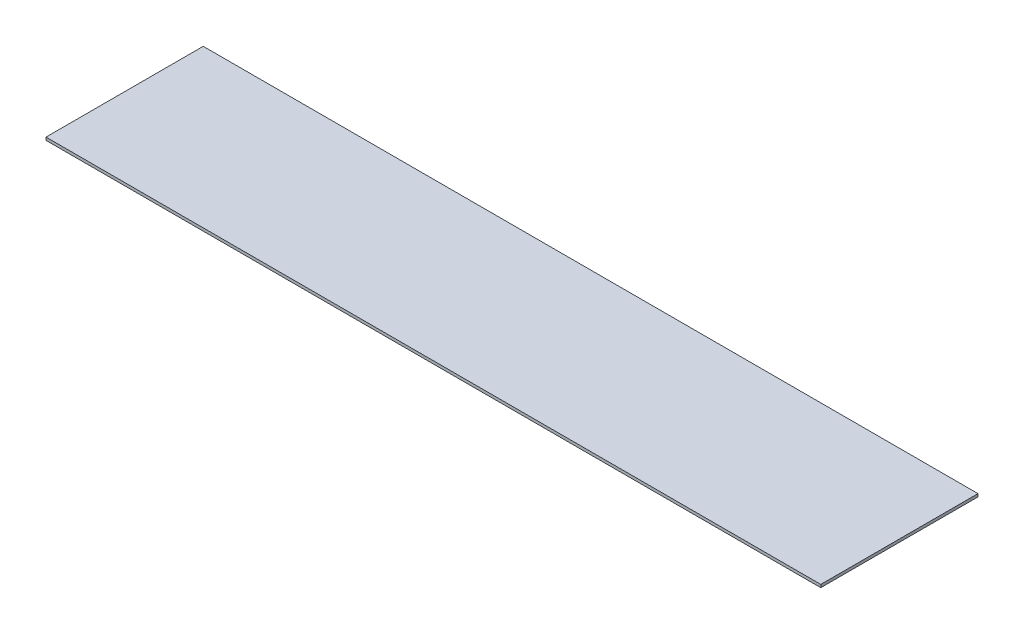
ISO-10303-21;
HEADER;
FILE_DESCRIPTION(('STEP AP214'),'2;1');
FILE_NAME('part.step','',(''),(''),'','','');
FILE_SCHEMA(('AUTOMOTIVE_DESIGN { 1 0 10303 214 1 1 1 1 }'));
ENDSEC;
DATA;
#1=APPLICATION_CONTEXT('core data for automotive mechanical design processes');
#2=APPLICATION_PROTOCOL_DEFINITION('international standard','automotive_design',2000,#1);
#3=PRODUCT_CONTEXT('',#1,'mechanical');
#4=PRODUCT('Part','Part','',(#3));
#5=PRODUCT_RELATED_PRODUCT_CATEGORY('part','',(#4));
#6=PRODUCT_DEFINITION_FORMATION('','',#4);
#7=PRODUCT_DEFINITION_CONTEXT('part definition',#1,'design');
#8=PRODUCT_DEFINITION('design','',#6,#7);
#9=PRODUCT_DEFINITION_SHAPE('','',#8);
#10=(LENGTH_UNIT() NAMED_UNIT(*) SI_UNIT(.MILLI.,.METRE.));
#11=(NAMED_UNIT(*) PLANE_ANGLE_UNIT() SI_UNIT($,.RADIAN.));
#12=(NAMED_UNIT(*) SI_UNIT($,.STERADIAN.) SOLID_ANGLE_UNIT());
#13=UNCERTAINTY_MEASURE_WITH_UNIT(LENGTH_MEASURE(1.E-05),#10,'distance_accuracy_value','');
#14=(GEOMETRIC_REPRESENTATION_CONTEXT(3) GLOBAL_UNCERTAINTY_ASSIGNED_CONTEXT((#13)) GLOBAL_UNIT_ASSIGNED_CONTEXT((#10,
#11,#12)) REPRESENTATION_CONTEXT('',''));
#15=CARTESIAN_POINT('',(0.,0.,0.));
#16=DIRECTION('',(0.,0.,1.));
#17=DIRECTION('',(1.,0.,0.));
#18=AXIS2_PLACEMENT_3D('',#15,#16,#17);
#19=CARTESIAN_POINT('',(0.,0.,110.));
#20=DIRECTION('',(0.,0.,1.));
#21=DIRECTION('',(1.,0.,0.));
#22=AXIS2_PLACEMENT_3D('',#19,#20,#21);
#23=PLANE('',#22);
#24=DIRECTION('',(-1.,0.,0.));
#25=VECTOR('',#24,1.);
#26=CARTESIAN_POINT('',(0.,-1.,110.));
#27=LINE('',#26,#25);
#28=CARTESIAN_POINT('',(271.,-1.,110.));
#29=VERTEX_POINT('',#28);
#30=CARTESIAN_POINT('',(-271.,-1.,110.));
#31=VERTEX_POINT('',#30);
#32=EDGE_CURVE('E10',#29,#31,#27,.T.);
#33=ORIENTED_EDGE('',*,*,#32,.F.);
#34=DIRECTION('',(0.,-1.,0.));
#35=VECTOR('',#34,1.);
#36=CARTESIAN_POINT('',(271.,0.,110.));
#37=LINE('',#36,#35);
#38=CARTESIAN_POINT('',(271.,1.,110.));
#39=VERTEX_POINT('',#38);
#40=EDGE_CURVE('E60',#39,#29,#37,.T.);
#41=ORIENTED_EDGE('',*,*,#40,.F.);
#42=DIRECTION('',(1.,0.,0.));
#43=VECTOR('',#42,1.);
#44=CARTESIAN_POINT('',(0.,1.,110.));
#45=LINE('',#44,#43);
#46=CARTESIAN_POINT('',(-271.,1.,110.));
#47=VERTEX_POINT('',#46);
#48=EDGE_CURVE('E86',#47,#39,#45,.T.);
#49=ORIENTED_EDGE('',*,*,#48,.F.);
#50=DIRECTION('',(0.,1.,0.));
#51=VECTOR('',#50,1.);
#52=CARTESIAN_POINT('',(-271.,0.,110.));
#53=LINE('',#52,#51);
#54=EDGE_CURVE('E23',#31,#47,#53,.T.);
#55=ORIENTED_EDGE('',*,*,#54,.F.);
#56=EDGE_LOOP('',(#33,#41,#49,#55));
#57=FACE_BOUND('',#56,.T.);
#58=ADVANCED_FACE('F16',(#57),#23,.T.);
#59=CARTESIAN_POINT('',(0.,-1.,0.));
#60=DIRECTION('',(0.,-1.,0.));
#61=DIRECTION('',(0.,0.,-1.));
#62=AXIS2_PLACEMENT_3D('',#59,#60,#61);
#63=PLANE('',#62);
#64=DIRECTION('',(0.,0.,1.));
#65=VECTOR('',#64,1.);
#66=CARTESIAN_POINT('',(271.,-1.,0.));
#67=LINE('',#66,#65);
#68=CARTESIAN_POINT('',(271.,-1.,0.));
#69=VERTEX_POINT('',#68);
#70=EDGE_CURVE('E53',#69,#29,#67,.T.);
#71=ORIENTED_EDGE('',*,*,#70,.T.);
#72=ORIENTED_EDGE('',*,*,#32,.T.);
#73=DIRECTION('',(0.,0.,1.));
#74=VECTOR('',#73,1.);
#75=CARTESIAN_POINT('',(-271.,-1.,0.));
#76=LINE('',#75,#74);
#77=CARTESIAN_POINT('',(-271.,-1.,0.));
#78=VERTEX_POINT('',#77);
#79=EDGE_CURVE('E66',#78,#31,#76,.T.);
#80=ORIENTED_EDGE('',*,*,#79,.F.);
#81=DIRECTION('',(1.,0.,0.));
#82=VECTOR('',#81,1.);
#83=CARTESIAN_POINT('',(0.,-1.,0.));
#84=LINE('',#83,#82);
#85=EDGE_CURVE('E64',#78,#69,#84,.T.);
#86=ORIENTED_EDGE('',*,*,#85,.T.);
#87=EDGE_LOOP('',(#71,#72,#80,#86));
#88=FACE_BOUND('',#87,.T.);
#89=ADVANCED_FACE('F65',(#88),#63,.T.);
#90=CARTESIAN_POINT('',(-271.,0.,0.));
#91=DIRECTION('',(-1.,0.,0.));
#92=DIRECTION('',(0.,0.,1.));
#93=AXIS2_PLACEMENT_3D('',#90,#91,#92);
#94=PLANE('',#93);
#95=ORIENTED_EDGE('',*,*,#79,.T.);
#96=ORIENTED_EDGE('',*,*,#54,.T.);
#97=DIRECTION('',(0.,0.,1.));
#98=VECTOR('',#97,1.);
#99=CARTESIAN_POINT('',(-271.,1.,0.));
#100=LINE('',#99,#98);
#101=CARTESIAN_POINT('',(-271.,1.,0.));
#102=VERTEX_POINT('',#101);
#103=EDGE_CURVE('E81',#102,#47,#100,.T.);
#104=ORIENTED_EDGE('',*,*,#103,.F.);
#105=DIRECTION('',(0.,-1.,0.));
#106=VECTOR('',#105,1.);
#107=CARTESIAN_POINT('',(-271.,0.,0.));
#108=LINE('',#107,#106);
#109=EDGE_CURVE('E70',#102,#78,#108,.T.);
#110=ORIENTED_EDGE('',*,*,#109,.T.);
#111=EDGE_LOOP('',(#95,#96,#104,#110));
#112=FACE_BOUND('',#111,.T.);
#113=ADVANCED_FACE('F90',(#112),#94,.T.);
#114=CARTESIAN_POINT('',(0.,1.,0.));
#115=DIRECTION('',(0.,1.,0.));
#116=DIRECTION('',(0.,0.,1.));
#117=AXIS2_PLACEMENT_3D('',#114,#115,#116);
#118=PLANE('',#117);
#119=ORIENTED_EDGE('',*,*,#103,.T.);
#120=ORIENTED_EDGE('',*,*,#48,.T.);
#121=DIRECTION('',(0.,0.,1.));
#122=VECTOR('',#121,1.);
#123=CARTESIAN_POINT('',(271.,1.,0.));
#124=LINE('',#123,#122);
#125=CARTESIAN_POINT('',(271.,1.,0.));
#126=VERTEX_POINT('',#125);
#127=EDGE_CURVE('E61',#126,#39,#124,.T.);
#128=ORIENTED_EDGE('',*,*,#127,.F.);
#129=DIRECTION('',(-1.,0.,0.));
#130=VECTOR('',#129,1.);
#131=CARTESIAN_POINT('',(0.,1.,0.));
#132=LINE('',#131,#130);
#133=EDGE_CURVE('E75',#126,#102,#132,.T.);
#134=ORIENTED_EDGE('',*,*,#133,.T.);
#135=EDGE_LOOP('',(#119,#120,#128,#134));
#136=FACE_BOUND('',#135,.T.);
#137=ADVANCED_FACE('F88',(#136),#118,.T.);
#138=CARTESIAN_POINT('',(0.,0.,0.));
#139=DIRECTION('',(0.,0.,-1.));
#140=DIRECTION('',(-1.,0.,0.));
#141=AXIS2_PLACEMENT_3D('',#138,#139,#140);
#142=PLANE('',#141);
#143=DIRECTION('',(0.,1.,0.));
#144=VECTOR('',#143,1.);
#145=CARTESIAN_POINT('',(271.,0.,0.));
#146=LINE('',#145,#144);
#147=EDGE_CURVE('E58',#69,#126,#146,.T.);
#148=ORIENTED_EDGE('',*,*,#147,.F.);
#149=ORIENTED_EDGE('',*,*,#85,.F.);
#150=ORIENTED_EDGE('',*,*,#109,.F.);
#151=ORIENTED_EDGE('',*,*,#133,.F.);
#152=EDGE_LOOP('',(#148,#149,#150,#151));
#153=FACE_BOUND('',#152,.T.);
#154=ADVANCED_FACE('F73',(#153),#142,.T.);
#155=CARTESIAN_POINT('',(271.,0.,0.));
#156=DIRECTION('',(1.,0.,0.));
#157=DIRECTION('',(0.,0.,-1.));
#158=AXIS2_PLACEMENT_3D('',#155,#156,#157);
#159=PLANE('',#158);
#160=ORIENTED_EDGE('',*,*,#147,.T.);
#161=ORIENTED_EDGE('',*,*,#127,.T.);
#162=ORIENTED_EDGE('',*,*,#40,.T.);
#163=ORIENTED_EDGE('',*,*,#70,.F.);
#164=EDGE_LOOP('',(#160,#161,#162,#163));
#165=FACE_BOUND('',#164,.T.);
#166=ADVANCED_FACE('F55',(#165),#159,.T.);
#167=CLOSED_SHELL('',(#58,#89,#113,#137,#154,#166));
#168=MANIFOLD_SOLID_BREP('B1',#167);
#169=ADVANCED_BREP_SHAPE_REPRESENTATION('',(#18,#168),#14);
#170=SHAPE_DEFINITION_REPRESENTATION(#9,#169);
ENDSEC;
END-ISO-10303-21;
